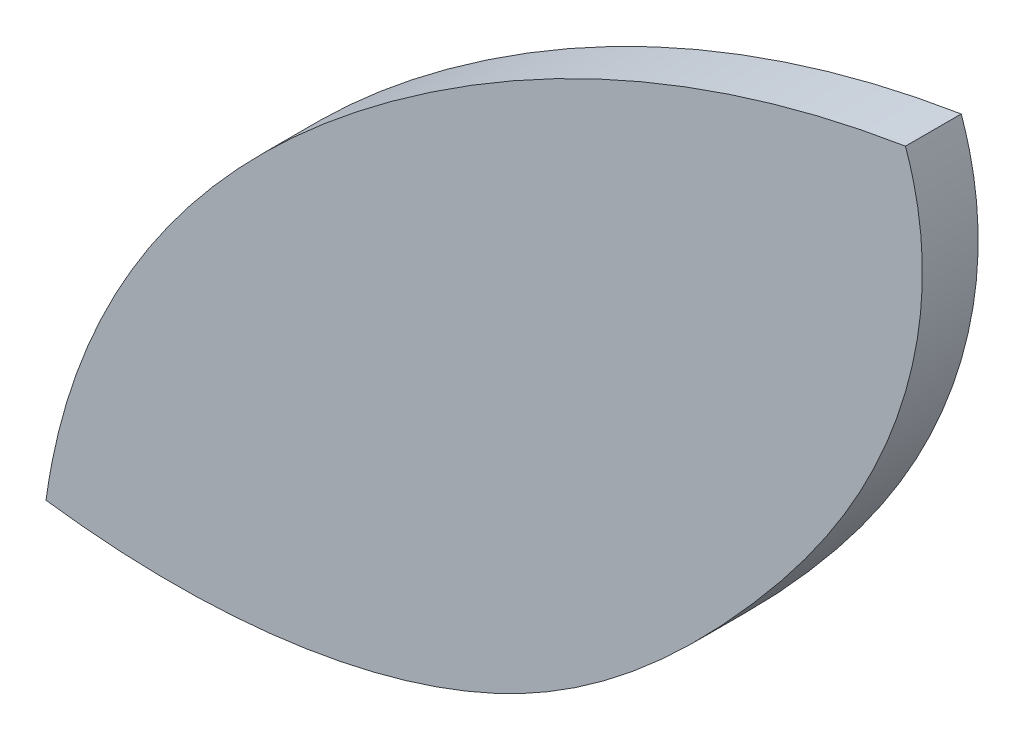
ISO-10303-21;
HEADER;
FILE_DESCRIPTION(('STEP AP214'),'2;1');
FILE_NAME('part.step','',(''),(''),'','','');
FILE_SCHEMA(('AUTOMOTIVE_DESIGN { 1 0 10303 214 1 1 1 1 }'));
ENDSEC;
DATA;
#1=APPLICATION_CONTEXT('core data for automotive mechanical design processes');
#2=APPLICATION_PROTOCOL_DEFINITION('international standard','automotive_design',2000,#1);
#3=PRODUCT_CONTEXT('',#1,'mechanical');
#4=PRODUCT('Part','Part','',(#3));
#5=PRODUCT_RELATED_PRODUCT_CATEGORY('part','',(#4));
#6=PRODUCT_DEFINITION_FORMATION('','',#4);
#7=PRODUCT_DEFINITION_CONTEXT('part definition',#1,'design');
#8=PRODUCT_DEFINITION('design','',#6,#7);
#9=PRODUCT_DEFINITION_SHAPE('','',#8);
#10=(LENGTH_UNIT() NAMED_UNIT(*) SI_UNIT(.MILLI.,.METRE.));
#11=(NAMED_UNIT(*) PLANE_ANGLE_UNIT() SI_UNIT($,.RADIAN.));
#12=(NAMED_UNIT(*) SI_UNIT($,.STERADIAN.) SOLID_ANGLE_UNIT());
#13=UNCERTAINTY_MEASURE_WITH_UNIT(LENGTH_MEASURE(1.E-05),#10,'distance_accuracy_value','');
#14=(GEOMETRIC_REPRESENTATION_CONTEXT(3) GLOBAL_UNCERTAINTY_ASSIGNED_CONTEXT((#13)) GLOBAL_UNIT_ASSIGNED_CONTEXT((#10,
#11,#12)) REPRESENTATION_CONTEXT('',''));
#15=CARTESIAN_POINT('',(0.,0.,0.));
#16=DIRECTION('',(0.,0.,1.));
#17=DIRECTION('',(1.,0.,0.));
#18=AXIS2_PLACEMENT_3D('',#15,#16,#17);
#19=CARTESIAN_POINT('',(-24.7333261195003,-18.1226928820741,4.49998925203115));
#20=CARTESIAN_POINT('',(-7.35432132167008,-20.4899367062436,4.49998925203115));
#21=CARTESIAN_POINT('',(22.7679742510447,-17.4617497997483,4.49998925203115));
#22=CARTESIAN_POINT('',(50.5543426149552,7.99481990690988,4.49998925203115));
#23=CARTESIAN_POINT('',(67.774460672747,31.4706755561409,4.49998925203115));
#24=CARTESIAN_POINT('',(71.1365374705057,51.5729517057356,4.49998925203115));
#25=CARTESIAN_POINT('',(67.7195833040606,61.090600871608,4.49998925203115));
#26=B_SPLINE_CURVE_WITH_KNOTS('',3,(#19,#20,#21,#22,#23,#24,#25),.UNSPECIFIED.,.F.,.F.,(4,1,1,1,
4),(0.,0.383387059858794,0.59213823907144,0.788086285039639,1.),.UNSPECIFIED.);
#27=DIRECTION('',(0.,0.,-1.));
#28=VECTOR('',#27,1.);
#29=SURFACE_OF_LINEAR_EXTRUSION('',#26,#28);
#30=CARTESIAN_POINT('',(-24.7333261195003,-18.1226928820741,-1.50001074796885));
#31=CARTESIAN_POINT('',(-7.35432132167008,-20.4899367062436,-1.50001074796885));
#32=CARTESIAN_POINT('',(22.7679742510447,-17.4617497997483,-1.50001074796885));
#33=CARTESIAN_POINT('',(50.5543426149552,7.99481990690988,-1.50001074796885));
#34=CARTESIAN_POINT('',(67.774460672747,31.4706755561409,-1.50001074796885));
#35=CARTESIAN_POINT('',(71.1365374705057,51.5729517057356,-1.50001074796885));
#36=CARTESIAN_POINT('',(67.7195833040606,61.090600871608,-1.50001074796885));
#37=B_SPLINE_CURVE_WITH_KNOTS('',3,(#30,#31,#32,#33,#34,#35,#36),.UNSPECIFIED.,.F.,.F.,(4,1,1,1,
4),(0.,0.383387059858794,0.59213823907144,0.788086285039639,1.),.UNSPECIFIED.);
#38=CARTESIAN_POINT('',(-24.7333261195003,-18.1226928820741,-1.50001074796885));
#39=VERTEX_POINT('',#38);
#40=CARTESIAN_POINT('',(67.7195833040606,61.090600871608,-1.50001074796885));
#41=VERTEX_POINT('',#40);
#42=EDGE_CURVE('E67',#39,#41,#37,.T.);
#43=ORIENTED_EDGE('',*,*,#42,.T.);
#44=DIRECTION('',(0.,0.,-1.));
#45=VECTOR('',#44,1.);
#46=CARTESIAN_POINT('',(67.7195833040606,61.090600871608,4.49998925203115));
#47=LINE('',#46,#45);
#48=CARTESIAN_POINT('',(67.7195833040606,61.090600871608,4.49998925203115));
#49=VERTEX_POINT('',#48);
#50=EDGE_CURVE('E11',#49,#41,#47,.T.);
#51=ORIENTED_EDGE('',*,*,#50,.F.);
#52=CARTESIAN_POINT('',(-24.7333261195003,-18.1226928820741,4.49998925203115));
#53=VERTEX_POINT('',#52);
#54=EDGE_CURVE('E66',#53,#49,#26,.T.);
#55=ORIENTED_EDGE('',*,*,#54,.F.);
#56=DIRECTION('',(0.,0.,-1.));
#57=VECTOR('',#56,1.);
#58=CARTESIAN_POINT('',(-24.7333261195003,-18.1226928820741,4.49998925203115));
#59=LINE('',#58,#57);
#60=EDGE_CURVE('E44',#53,#39,#59,.T.);
#61=ORIENTED_EDGE('',*,*,#60,.T.);
#62=EDGE_LOOP('',(#43,#51,#55,#61));
#63=FACE_BOUND('',#62,.T.);
#64=ADVANCED_FACE('F35',(#63),#29,.F.);
#65=CARTESIAN_POINT('',(67.7195833040606,61.090600871608,4.49998925203115));
#66=CARTESIAN_POINT('',(48.4221254718729,57.9882347641562,4.49998925203115));
#67=CARTESIAN_POINT('',(7.91686316312851,40.7092972845037,4.49998925203115));
#68=CARTESIAN_POINT('',(-21.4462266609034,5.99335575091453,4.49998925203115));
#69=CARTESIAN_POINT('',(-24.7333261195003,-18.1226928820741,4.49998925203115));
#70=B_SPLINE_CURVE_WITH_KNOTS('',3,(#65,#66,#67,#68,#69),.UNSPECIFIED.,.F.,.F.,(4,1,4),(0.,
0.455077965932473,1.),.UNSPECIFIED.);
#71=DIRECTION('',(0.,0.,-1.));
#72=VECTOR('',#71,1.);
#73=SURFACE_OF_LINEAR_EXTRUSION('',#70,#72);
#74=CARTESIAN_POINT('',(67.7195833040606,61.090600871608,-1.50001074796885));
#75=CARTESIAN_POINT('',(48.4221254718729,57.9882347641562,-1.50001074796885));
#76=CARTESIAN_POINT('',(7.91686316312851,40.7092972845037,-1.50001074796885));
#77=CARTESIAN_POINT('',(-21.4462266609034,5.99335575091453,-1.50001074796885));
#78=CARTESIAN_POINT('',(-24.7333261195003,-18.1226928820741,-1.50001074796885));
#79=B_SPLINE_CURVE_WITH_KNOTS('',3,(#74,#75,#76,#77,#78),.UNSPECIFIED.,.F.,.F.,(4,1,4),(0.,
0.455077965932473,1.),.UNSPECIFIED.);
#80=EDGE_CURVE('E59',#41,#39,#79,.T.);
#81=ORIENTED_EDGE('',*,*,#80,.T.);
#82=ORIENTED_EDGE('',*,*,#60,.F.);
#83=EDGE_CURVE('E51',#49,#53,#70,.T.);
#84=ORIENTED_EDGE('',*,*,#83,.F.);
#85=ORIENTED_EDGE('',*,*,#50,.T.);
#86=EDGE_LOOP('',(#81,#82,#84,#85));
#87=FACE_BOUND('',#86,.T.);
#88=ADVANCED_FACE('F62',(#87),#73,.F.);
#89=CARTESIAN_POINT('',(41.0235137670441,-0.23993581759919,4.49998925203115));
#90=DIRECTION('',(0.,0.,1.));
#91=DIRECTION('',(1.,0.,0.));
#92=AXIS2_PLACEMENT_3D('',#89,#90,#91);
#93=PLANE('',#92);
#94=ORIENTED_EDGE('',*,*,#54,.T.);
#95=ORIENTED_EDGE('',*,*,#83,.T.);
#96=EDGE_LOOP('',(#94,#95));
#97=FACE_BOUND('',#96,.T.);
#98=ADVANCED_FACE('F94',(#97),#93,.T.);
#99=CARTESIAN_POINT('',(41.0235137670441,-0.23993581759919,-1.50001074796885));
#100=DIRECTION('',(0.,0.,1.));
#101=DIRECTION('',(1.,0.,0.));
#102=AXIS2_PLACEMENT_3D('',#99,#100,#101);
#103=PLANE('',#102);
#104=ORIENTED_EDGE('',*,*,#42,.F.);
#105=ORIENTED_EDGE('',*,*,#80,.F.);
#106=EDGE_LOOP('',(#104,#105));
#107=FACE_BOUND('',#106,.T.);
#108=ADVANCED_FACE('F70',(#107),#103,.F.);
#109=CLOSED_SHELL('',(#64,#88,#98,#108));
#110=MANIFOLD_SOLID_BREP('B2',#109);
#111=ADVANCED_BREP_SHAPE_REPRESENTATION('',(#18,#110),#14);
#112=SHAPE_DEFINITION_REPRESENTATION(#9,#111);
ENDSEC;
END-ISO-10303-21;
